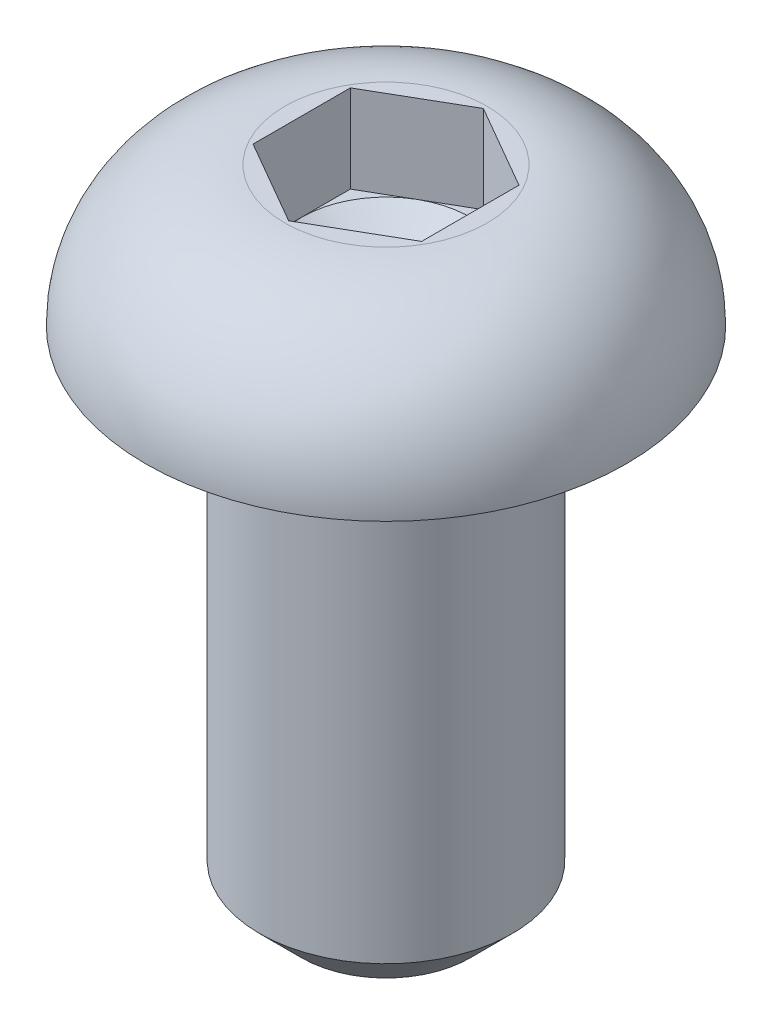
ISO-10303-21;
HEADER;
FILE_DESCRIPTION(('STEP AP214'),'2;1');
FILE_NAME('part.step','',(''),(''),'','','');
FILE_SCHEMA(('AUTOMOTIVE_DESIGN { 1 0 10303 214 1 1 1 1 }'));
ENDSEC;
DATA;
#1=APPLICATION_CONTEXT('core data for automotive mechanical design processes');
#2=APPLICATION_PROTOCOL_DEFINITION('international standard','automotive_design',2000,#1);
#3=PRODUCT_CONTEXT('',#1,'mechanical');
#4=PRODUCT('Part','Part','',(#3));
#5=PRODUCT_RELATED_PRODUCT_CATEGORY('part','',(#4));
#6=PRODUCT_DEFINITION_FORMATION('','',#4);
#7=PRODUCT_DEFINITION_CONTEXT('part definition',#1,'design');
#8=PRODUCT_DEFINITION('design','',#6,#7);
#9=PRODUCT_DEFINITION_SHAPE('','',#8);
#10=(LENGTH_UNIT() NAMED_UNIT(*) SI_UNIT(.MILLI.,.METRE.));
#11=(NAMED_UNIT(*) PLANE_ANGLE_UNIT() SI_UNIT($,.RADIAN.));
#12=(NAMED_UNIT(*) SI_UNIT($,.STERADIAN.) SOLID_ANGLE_UNIT());
#13=UNCERTAINTY_MEASURE_WITH_UNIT(LENGTH_MEASURE(1.E-05),#10,'distance_accuracy_value','');
#14=(GEOMETRIC_REPRESENTATION_CONTEXT(3) GLOBAL_UNCERTAINTY_ASSIGNED_CONTEXT((#13)) GLOBAL_UNIT_ASSIGNED_CONTEXT((#10,
#11,#12)) REPRESENTATION_CONTEXT('',''));
#15=CARTESIAN_POINT('',(0.,0.,0.));
#16=DIRECTION('',(0.,0.,1.));
#17=DIRECTION('',(1.,0.,0.));
#18=AXIS2_PLACEMENT_3D('',#15,#16,#17);
#19=CARTESIAN_POINT('',(0.,0.60999999999467,0.));
#20=DIRECTION('',(0.,1.,0.));
#21=DIRECTION('',(0.,0.,1.));
#22=AXIS2_PLACEMENT_3D('',#19,#20,#21);
#23=CONICAL_SURFACE('',#22,0.99999999991951,1.04719755099412);
#24=CARTESIAN_POINT('',(-1.13686837721616E-10,0.0326497307696627,0.));
#25=VERTEX_POINT('',#24);
#26=VERTEX_LOOP('',#25);
#27=FACE_BOUND('',#26,.T.);
#28=CARTESIAN_POINT('',(0.,0.610000000060308,0.));
#29=DIRECTION('',(0.,1.,0.));
#30=DIRECTION('',(0.,0.,1.));
#31=AXIS2_PLACEMENT_3D('',#28,#29,#30);
#32=CIRCLE('',#31,1.0000000000332);
#33=CARTESIAN_POINT('',(-0.500000000008299,0.610000000030154,-0.866025403798813));
#34=VERTEX_POINT('',#33);
#35=CARTESIAN_POINT('',(0.500000000008297,0.610000000030154,-0.866025403798814));
#36=VERTEX_POINT('',#35);
#37=EDGE_CURVE('E20',#34,#36,#32,.F.);
#38=ORIENTED_EDGE('',*,*,#37,.F.);
#39=CARTESIAN_POINT('',(0.,0.610000000060308,0.));
#40=DIRECTION('',(0.,1.,0.));
#41=DIRECTION('',(0.,0.,1.));
#42=AXIS2_PLACEMENT_3D('',#39,#40,#41);
#43=CIRCLE('',#42,1.0000000000332);
#44=CARTESIAN_POINT('',(-1.0000000000166,0.610000000030154,0.));
#45=VERTEX_POINT('',#44);
#46=EDGE_CURVE('E151',#45,#34,#43,.F.);
#47=ORIENTED_EDGE('',*,*,#46,.F.);
#48=CARTESIAN_POINT('',(0.,0.610000000060308,0.));
#49=DIRECTION('',(0.,1.,0.));
#50=DIRECTION('',(0.,0.,1.));
#51=AXIS2_PLACEMENT_3D('',#48,#49,#50);
#52=CIRCLE('',#51,1.0000000000332);
#53=CARTESIAN_POINT('',(-0.5000000000083,0.610000000030154,0.866025403798813));
#54=VERTEX_POINT('',#53);
#55=EDGE_CURVE('E127',#54,#45,#52,.F.);
#56=ORIENTED_EDGE('',*,*,#55,.F.);
#57=CARTESIAN_POINT('',(0.,0.610000000060308,0.));
#58=DIRECTION('',(0.,1.,0.));
#59=DIRECTION('',(0.,0.,1.));
#60=AXIS2_PLACEMENT_3D('',#57,#58,#59);
#61=CIRCLE('',#60,1.0000000000332);
#62=CARTESIAN_POINT('',(0.5000000000083,0.610000000030154,0.866025403798812));
#63=VERTEX_POINT('',#62);
#64=EDGE_CURVE('E153',#63,#54,#61,.F.);
#65=ORIENTED_EDGE('',*,*,#64,.F.);
#66=CARTESIAN_POINT('',(0.,0.610000000060308,0.));
#67=DIRECTION('',(0.,1.,0.));
#68=DIRECTION('',(0.,0.,1.));
#69=AXIS2_PLACEMENT_3D('',#66,#67,#68);
#70=CIRCLE('',#69,1.0000000000332);
#71=CARTESIAN_POINT('',(1.0000000000166,0.610000000030154,0.));
#72=VERTEX_POINT('',#71);
#73=EDGE_CURVE('E94',#72,#63,#70,.F.);
#74=ORIENTED_EDGE('',*,*,#73,.F.);
#75=CARTESIAN_POINT('',(0.,0.610000000060308,0.));
#76=DIRECTION('',(0.,1.,0.));
#77=DIRECTION('',(0.,0.,1.));
#78=AXIS2_PLACEMENT_3D('',#75,#76,#77);
#79=CIRCLE('',#78,1.0000000000332);
#80=EDGE_CURVE('E91',#36,#72,#79,.F.);
#81=ORIENTED_EDGE('',*,*,#80,.F.);
#82=EDGE_LOOP('',(#38,#47,#56,#65,#74,#81));
#83=FACE_BOUND('',#82,.T.);
#84=ADVANCED_FACE('F17',(#27,#83),#23,.F.);
#85=CARTESIAN_POINT('',(0.,0.61,0.));
#86=DIRECTION('',(0.,1.,0.));
#87=DIRECTION('',(0.,0.,1.));
#88=AXIS2_PLACEMENT_3D('',#85,#86,#87);
#89=PLANE('',#88);
#90=DIRECTION('',(-0.86602540378444,0.,-0.499999999999998));
#91=VECTOR('',#90,1.);
#92=CARTESIAN_POINT('',(1.,0.61,-0.577350269189627));
#93=LINE('',#92,#91);
#94=CARTESIAN_POINT('',(0.,0.61,-1.15470053837925));
#95=VERTEX_POINT('',#94);
#96=EDGE_CURVE('E105',#36,#95,#93,.T.);
#97=ORIENTED_EDGE('',*,*,#96,.T.);
#98=DIRECTION('',(-0.866025403784439,0.,0.5));
#99=VECTOR('',#98,1.);
#100=CARTESIAN_POINT('',(0.,0.61,-1.15470053837925));
#101=LINE('',#100,#99);
#102=EDGE_CURVE('E111',#95,#34,#101,.T.);
#103=ORIENTED_EDGE('',*,*,#102,.T.);
#104=ORIENTED_EDGE('',*,*,#37,.T.);
#105=EDGE_LOOP('',(#97,#103,#104));
#106=FACE_BOUND('',#105,.T.);
#107=ADVANCED_FACE('F109',(#106),#89,.T.);
#108=CARTESIAN_POINT('',(0.,0.61,0.));
#109=DIRECTION('',(0.,1.,0.));
#110=DIRECTION('',(0.,0.,1.));
#111=AXIS2_PLACEMENT_3D('',#108,#109,#110);
#112=PLANE('',#111);
#113=DIRECTION('',(0.,0.,-1.));
#114=VECTOR('',#113,1.);
#115=CARTESIAN_POINT('',(1.,0.61,0.577350269189625));
#116=LINE('',#115,#114);
#117=CARTESIAN_POINT('',(1.,0.61,-0.577350269189627));
#118=VERTEX_POINT('',#117);
#119=EDGE_CURVE('E101',#72,#118,#116,.T.);
#120=ORIENTED_EDGE('',*,*,#119,.T.);
#121=DIRECTION('',(-0.86602540378444,0.,-0.499999999999998));
#122=VECTOR('',#121,1.);
#123=CARTESIAN_POINT('',(1.,0.61,-0.577350269189627));
#124=LINE('',#123,#122);
#125=EDGE_CURVE('E99',#118,#36,#124,.T.);
#126=ORIENTED_EDGE('',*,*,#125,.T.);
#127=ORIENTED_EDGE('',*,*,#80,.T.);
#128=EDGE_LOOP('',(#120,#126,#127));
#129=FACE_BOUND('',#128,.T.);
#130=ADVANCED_FACE('F100',(#129),#112,.T.);
#131=CARTESIAN_POINT('',(0.,0.61,0.));
#132=DIRECTION('',(0.,1.,0.));
#133=DIRECTION('',(0.,0.,1.));
#134=AXIS2_PLACEMENT_3D('',#131,#132,#133);
#135=PLANE('',#134);
#136=DIRECTION('',(0.866025403784438,0.,-0.500000000000001));
#137=VECTOR('',#136,1.);
#138=CARTESIAN_POINT('',(0.,0.61,1.15470053837925));
#139=LINE('',#138,#137);
#140=CARTESIAN_POINT('',(0.999999999999999,0.61,0.577350269189624));
#141=VERTEX_POINT('',#140);
#142=EDGE_CURVE('E159',#63,#141,#139,.T.);
#143=ORIENTED_EDGE('',*,*,#142,.T.);
#144=DIRECTION('',(0.,0.,-1.));
#145=VECTOR('',#144,1.);
#146=CARTESIAN_POINT('',(1.,0.61,0.577350269189625));
#147=LINE('',#146,#145);
#148=EDGE_CURVE('E118',#141,#72,#147,.T.);
#149=ORIENTED_EDGE('',*,*,#148,.T.);
#150=ORIENTED_EDGE('',*,*,#73,.T.);
#151=EDGE_LOOP('',(#143,#149,#150));
#152=FACE_BOUND('',#151,.T.);
#153=ADVANCED_FACE('F158',(#152),#135,.T.);
#154=CARTESIAN_POINT('',(0.,0.61,0.));
#155=DIRECTION('',(0.,1.,0.));
#156=DIRECTION('',(0.,0.,1.));
#157=AXIS2_PLACEMENT_3D('',#154,#155,#156);
#158=PLANE('',#157);
#159=DIRECTION('',(0.866025403784438,0.,0.500000000000001));
#160=VECTOR('',#159,1.);
#161=CARTESIAN_POINT('',(-1.,0.61,0.577350269189625));
#162=LINE('',#161,#160);
#163=CARTESIAN_POINT('',(0.,0.61,1.15470053837925));
#164=VERTEX_POINT('',#163);
#165=EDGE_CURVE('E223',#54,#164,#162,.T.);
#166=ORIENTED_EDGE('',*,*,#165,.T.);
#167=DIRECTION('',(0.866025403784438,0.,-0.500000000000001));
#168=VECTOR('',#167,1.);
#169=CARTESIAN_POINT('',(0.,0.61,1.15470053837925));
#170=LINE('',#169,#168);
#171=EDGE_CURVE('E166',#164,#63,#170,.T.);
#172=ORIENTED_EDGE('',*,*,#171,.T.);
#173=ORIENTED_EDGE('',*,*,#64,.T.);
#174=EDGE_LOOP('',(#166,#172,#173));
#175=FACE_BOUND('',#174,.T.);
#176=ADVANCED_FACE('F320',(#175),#158,.T.);
#177=CARTESIAN_POINT('',(0.,0.61,0.));
#178=DIRECTION('',(0.,1.,0.));
#179=DIRECTION('',(0.,0.,1.));
#180=AXIS2_PLACEMENT_3D('',#177,#178,#179);
#181=PLANE('',#180);
#182=DIRECTION('',(-0.866025403784439,0.,0.5));
#183=VECTOR('',#182,1.);
#184=CARTESIAN_POINT('',(0.,0.61,-1.15470053837925));
#185=LINE('',#184,#183);
#186=CARTESIAN_POINT('',(-1.,0.61,-0.577350269189627));
#187=VERTEX_POINT('',#186);
#188=EDGE_CURVE('E106',#34,#187,#185,.T.);
#189=ORIENTED_EDGE('',*,*,#188,.T.);
#190=DIRECTION('',(0.,0.,1.));
#191=VECTOR('',#190,1.);
#192=CARTESIAN_POINT('',(-1.,0.61,-0.577350269189627));
#193=LINE('',#192,#191);
#194=EDGE_CURVE('E211',#187,#45,#193,.T.);
#195=ORIENTED_EDGE('',*,*,#194,.T.);
#196=ORIENTED_EDGE('',*,*,#46,.T.);
#197=EDGE_LOOP('',(#189,#195,#196));
#198=FACE_BOUND('',#197,.T.);
#199=ADVANCED_FACE('F316',(#198),#181,.T.);
#200=CARTESIAN_POINT('',(0.,0.61,0.));
#201=DIRECTION('',(0.,1.,0.));
#202=DIRECTION('',(0.,0.,1.));
#203=AXIS2_PLACEMENT_3D('',#200,#201,#202);
#204=PLANE('',#203);
#205=DIRECTION('',(0.,0.,1.));
#206=VECTOR('',#205,1.);
#207=CARTESIAN_POINT('',(-1.,0.61,-0.577350269189627));
#208=LINE('',#207,#206);
#209=CARTESIAN_POINT('',(-1.,0.61,0.577350269189625));
#210=VERTEX_POINT('',#209);
#211=EDGE_CURVE('E214',#45,#210,#208,.T.);
#212=ORIENTED_EDGE('',*,*,#211,.T.);
#213=DIRECTION('',(0.866025403784438,0.,0.500000000000001));
#214=VECTOR('',#213,1.);
#215=CARTESIAN_POINT('',(-1.,0.61,0.577350269189625));
#216=LINE('',#215,#214);
#217=EDGE_CURVE('E171',#210,#54,#216,.T.);
#218=ORIENTED_EDGE('',*,*,#217,.T.);
#219=ORIENTED_EDGE('',*,*,#55,.T.);
#220=EDGE_LOOP('',(#212,#218,#219));
#221=FACE_BOUND('',#220,.T.);
#222=ADVANCED_FACE('F312',(#221),#204,.T.);
#223=CARTESIAN_POINT('',(0.,0.61,-1.15470053837925));
#224=DIRECTION('',(-0.5,0.,-0.866025403784439));
#225=DIRECTION('',(-0.866025403784439,0.,0.5));
#226=AXIS2_PLACEMENT_3D('',#223,#224,#225);
#227=PLANE('',#226);
#228=DIRECTION('',(0.,1.,0.));
#229=VECTOR('',#228,1.);
#230=CARTESIAN_POINT('',(-1.,0.61,-0.577350269189627));
#231=LINE('',#230,#229);
#232=CARTESIAN_POINT('',(-1.,1.65,-0.577350269189627));
#233=VERTEX_POINT('',#232);
#234=EDGE_CURVE('E215',#233,#187,#231,.F.);
#235=ORIENTED_EDGE('',*,*,#234,.T.);
#236=ORIENTED_EDGE('',*,*,#188,.F.);
#237=ORIENTED_EDGE('',*,*,#102,.F.);
#238=DIRECTION('',(0.,1.,0.));
#239=VECTOR('',#238,1.);
#240=CARTESIAN_POINT('',(0.,0.61,-1.15470053837925));
#241=LINE('',#240,#239);
#242=CARTESIAN_POINT('',(0.,1.65,-1.15470053837925));
#243=VERTEX_POINT('',#242);
#244=EDGE_CURVE('E116',#95,#243,#241,.T.);
#245=ORIENTED_EDGE('',*,*,#244,.T.);
#246=DIRECTION('',(0.866025403784439,0.,-0.499999999999999));
#247=VECTOR('',#246,1.);
#248=CARTESIAN_POINT('',(-1.,1.65,-0.577350269189627));
#249=LINE('',#248,#247);
#250=EDGE_CURVE('E206',#233,#243,#249,.T.);
#251=ORIENTED_EDGE('',*,*,#250,.F.);
#252=EDGE_LOOP('',(#235,#236,#237,#245,#251));
#253=FACE_BOUND('',#252,.T.);
#254=ADVANCED_FACE('F309',(#253),#227,.F.);
#255=CARTESIAN_POINT('',(1.,0.61,-0.577350269189627));
#256=DIRECTION('',(0.499999999999998,0.,-0.86602540378444));
#257=DIRECTION('',(-0.86602540378444,0.,-0.499999999999998));
#258=AXIS2_PLACEMENT_3D('',#255,#256,#257);
#259=PLANE('',#258);
#260=ORIENTED_EDGE('',*,*,#244,.F.);
#261=ORIENTED_EDGE('',*,*,#96,.F.);
#262=ORIENTED_EDGE('',*,*,#125,.F.);
#263=DIRECTION('',(0.,1.,0.));
#264=VECTOR('',#263,1.);
#265=CARTESIAN_POINT('',(1.,0.61,-0.577350269189627));
#266=LINE('',#265,#264);
#267=CARTESIAN_POINT('',(1.,1.65,-0.577350269189627));
#268=VERTEX_POINT('',#267);
#269=EDGE_CURVE('E173',#118,#268,#266,.T.);
#270=ORIENTED_EDGE('',*,*,#269,.T.);
#271=DIRECTION('',(0.86602540378444,0.,0.499999999999997));
#272=VECTOR('',#271,1.);
#273=CARTESIAN_POINT('',(0.,1.65,-1.15470053837925));
#274=LINE('',#273,#272);
#275=EDGE_CURVE('E192',#243,#268,#274,.T.);
#276=ORIENTED_EDGE('',*,*,#275,.F.);
#277=EDGE_LOOP('',(#260,#261,#262,#270,#276));
#278=FACE_BOUND('',#277,.T.);
#279=ADVANCED_FACE('F114',(#278),#259,.F.);
#280=CARTESIAN_POINT('',(1.,0.61,0.577350269189625));
#281=DIRECTION('',(1.,0.,0.));
#282=DIRECTION('',(0.,0.,-1.));
#283=AXIS2_PLACEMENT_3D('',#280,#281,#282);
#284=PLANE('',#283);
#285=ORIENTED_EDGE('',*,*,#269,.F.);
#286=ORIENTED_EDGE('',*,*,#119,.F.);
#287=ORIENTED_EDGE('',*,*,#148,.F.);
#288=DIRECTION('',(0.,1.,0.));
#289=VECTOR('',#288,1.);
#290=CARTESIAN_POINT('',(0.999999999999999,0.61,0.577350269189623));
#291=LINE('',#290,#289);
#292=CARTESIAN_POINT('',(1.,1.65,0.577350269189625));
#293=VERTEX_POINT('',#292);
#294=EDGE_CURVE('E169',#141,#293,#291,.T.);
#295=ORIENTED_EDGE('',*,*,#294,.T.);
#296=DIRECTION('',(0.,0.,1.));
#297=VECTOR('',#296,1.);
#298=CARTESIAN_POINT('',(1.,1.65,0.));
#299=LINE('',#298,#297);
#300=EDGE_CURVE('E196',#268,#293,#299,.T.);
#301=ORIENTED_EDGE('',*,*,#300,.F.);
#302=EDGE_LOOP('',(#285,#286,#287,#295,#301));
#303=FACE_BOUND('',#302,.T.);
#304=ADVANCED_FACE('F197',(#303),#284,.F.);
#305=CARTESIAN_POINT('',(0.,0.61,1.15470053837925));
#306=DIRECTION('',(0.500000000000001,0.,0.866025403784438));
#307=DIRECTION('',(0.866025403784438,0.,-0.500000000000001));
#308=AXIS2_PLACEMENT_3D('',#305,#306,#307);
#309=PLANE('',#308);
#310=ORIENTED_EDGE('',*,*,#294,.F.);
#311=ORIENTED_EDGE('',*,*,#142,.F.);
#312=ORIENTED_EDGE('',*,*,#171,.F.);
#313=DIRECTION('',(0.,1.,0.));
#314=VECTOR('',#313,1.);
#315=CARTESIAN_POINT('',(0.,0.61,1.15470053837925));
#316=LINE('',#315,#314);
#317=CARTESIAN_POINT('',(0.,1.65,1.15470053837925));
#318=VERTEX_POINT('',#317);
#319=EDGE_CURVE('E231',#164,#318,#316,.T.);
#320=ORIENTED_EDGE('',*,*,#319,.T.);
#321=DIRECTION('',(-0.866025403784439,0.,0.499999999999999));
#322=VECTOR('',#321,1.);
#323=CARTESIAN_POINT('',(1.,1.65,0.577350269189625));
#324=LINE('',#323,#322);
#325=EDGE_CURVE('E200',#293,#318,#324,.T.);
#326=ORIENTED_EDGE('',*,*,#325,.F.);
#327=EDGE_LOOP('',(#310,#311,#312,#320,#326));
#328=FACE_BOUND('',#327,.T.);
#329=ADVANCED_FACE('F164',(#328),#309,.F.);
#330=CARTESIAN_POINT('',(-1.,0.61,0.577350269189625));
#331=DIRECTION('',(-0.500000000000001,0.,0.866025403784438));
#332=DIRECTION('',(0.866025403784438,0.,0.500000000000001));
#333=AXIS2_PLACEMENT_3D('',#330,#331,#332);
#334=PLANE('',#333);
#335=ORIENTED_EDGE('',*,*,#319,.F.);
#336=ORIENTED_EDGE('',*,*,#165,.F.);
#337=ORIENTED_EDGE('',*,*,#217,.F.);
#338=DIRECTION('',(0.,1.,0.));
#339=VECTOR('',#338,1.);
#340=CARTESIAN_POINT('',(-1.,0.61,0.577350269189625));
#341=LINE('',#340,#339);
#342=CARTESIAN_POINT('',(-1.,1.65,0.577350269189625));
#343=VERTEX_POINT('',#342);
#344=EDGE_CURVE('E35',#210,#343,#341,.T.);
#345=ORIENTED_EDGE('',*,*,#344,.T.);
#346=DIRECTION('',(-0.866025403784439,0.,-0.499999999999999));
#347=VECTOR('',#346,1.);
#348=CARTESIAN_POINT('',(0.,1.65,1.15470053837925));
#349=LINE('',#348,#347);
#350=EDGE_CURVE('E240',#318,#343,#349,.T.);
#351=ORIENTED_EDGE('',*,*,#350,.F.);
#352=EDGE_LOOP('',(#335,#336,#337,#345,#351));
#353=FACE_BOUND('',#352,.T.);
#354=ADVANCED_FACE('F248',(#353),#334,.F.);
#355=CARTESIAN_POINT('',(-1.,0.61,-0.577350269189627));
#356=DIRECTION('',(-1.,0.,0.));
#357=DIRECTION('',(0.,0.,1.));
#358=AXIS2_PLACEMENT_3D('',#355,#356,#357);
#359=PLANE('',#358);
#360=ORIENTED_EDGE('',*,*,#344,.F.);
#361=ORIENTED_EDGE('',*,*,#211,.F.);
#362=ORIENTED_EDGE('',*,*,#194,.F.);
#363=ORIENTED_EDGE('',*,*,#234,.F.);
#364=DIRECTION('',(0.,0.,1.));
#365=VECTOR('',#364,1.);
#366=CARTESIAN_POINT('',(-1.,1.65,0.));
#367=LINE('',#366,#365);
#368=EDGE_CURVE('E146',#343,#233,#367,.F.);
#369=ORIENTED_EDGE('',*,*,#368,.F.);
#370=EDGE_LOOP('',(#360,#361,#362,#363,#369));
#371=FACE_BOUND('',#370,.T.);
#372=ADVANCED_FACE('F297',(#371),#359,.F.);
#373=CARTESIAN_POINT('',(0.,1.65,0.));
#374=DIRECTION('',(0.,1.,0.));
#375=DIRECTION('',(0.,0.,1.));
#376=AXIS2_PLACEMENT_3D('',#373,#374,#375);
#377=PLANE('',#376);
#378=ORIENTED_EDGE('',*,*,#350,.T.);
#379=ORIENTED_EDGE('',*,*,#368,.T.);
#380=ORIENTED_EDGE('',*,*,#250,.T.);
#381=ORIENTED_EDGE('',*,*,#275,.T.);
#382=ORIENTED_EDGE('',*,*,#300,.T.);
#383=ORIENTED_EDGE('',*,*,#325,.T.);
#384=EDGE_LOOP('',(#378,#379,#380,#381,#382,#383));
#385=FACE_BOUND('',#384,.T.);
#386=CARTESIAN_POINT('',(0.,1.65000000000001,0.));
#387=DIRECTION('',(0.,-1.,0.));
#388=DIRECTION('',(0.,0.,-1.));
#389=AXIS2_PLACEMENT_3D('',#386,#387,#388);
#390=CIRCLE('',#389,1.19999999999978);
#391=CARTESIAN_POINT('',(0.,1.65000000000001,-1.19999999999978));
#392=VERTEX_POINT('',#391);
#393=EDGE_CURVE('E141',#392,#392,#390,.T.);
#394=ORIENTED_EDGE('',*,*,#393,.F.);
#395=EDGE_LOOP('',(#394));
#396=FACE_BOUND('',#395,.T.);
#397=ADVANCED_FACE('F203',(#385,#396),#377,.T.);
#398=CARTESIAN_POINT('',(0.,-2.1325005253703E-13,0.));
#399=DIRECTION('',(0.,-1.,0.));
#400=DIRECTION('',(0.,0.,1.));
#401=AXIS2_PLACEMENT_3D('',#398,#399,#400);
#402=DEGENERATE_TOROIDAL_SURFACE('',#401,1.19999999999978,1.65000000000022,.T.);
#403=CARTESIAN_POINT('',(0.,0.,0.));
#404=DIRECTION('',(0.,-1.,0.));
#405=DIRECTION('',(0.,0.,-1.));
#406=AXIS2_PLACEMENT_3D('',#403,#404,#405);
#407=CIRCLE('',#406,2.85);
#408=CARTESIAN_POINT('',(0.,0.,-2.85));
#409=VERTEX_POINT('',#408);
#410=EDGE_CURVE('E138',#409,#409,#407,.T.);
#411=ORIENTED_EDGE('',*,*,#410,.F.);
#412=EDGE_LOOP('',(#411));
#413=FACE_BOUND('',#412,.T.);
#414=ORIENTED_EDGE('',*,*,#393,.T.);
#415=EDGE_LOOP('',(#414));
#416=FACE_BOUND('',#415,.T.);
#417=ADVANCED_FACE('F291',(#413,#416),#402,.T.);
#418=CARTESIAN_POINT('',(0.,0.,0.));
#419=DIRECTION('',(0.,-1.,0.));
#420=DIRECTION('',(0.,0.,-1.));
#421=AXIS2_PLACEMENT_3D('',#418,#419,#420);
#422=PLANE('',#421);
#423=CARTESIAN_POINT('',(0.,0.,0.));
#424=DIRECTION('',(0.,-1.,0.));
#425=DIRECTION('',(0.,0.,1.));
#426=AXIS2_PLACEMENT_3D('',#423,#424,#425);
#427=CIRCLE('',#426,1.6);
#428=CARTESIAN_POINT('',(0.,0.,1.6));
#429=VERTEX_POINT('',#428);
#430=EDGE_CURVE('E135',#429,#429,#427,.F.);
#431=ORIENTED_EDGE('',*,*,#430,.T.);
#432=EDGE_LOOP('',(#431));
#433=FACE_BOUND('',#432,.T.);
#434=ORIENTED_EDGE('',*,*,#410,.T.);
#435=EDGE_LOOP('',(#434));
#436=FACE_BOUND('',#435,.T.);
#437=ADVANCED_FACE('F282',(#433,#436),#422,.T.);
#438=CARTESIAN_POINT('',(0.,-6.,0.));
#439=DIRECTION('',(0.,-1.,0.));
#440=DIRECTION('',(0.,0.,-1.));
#441=AXIS2_PLACEMENT_3D('',#438,#439,#440);
#442=PLANE('',#441);
#443=CARTESIAN_POINT('',(0.,-6.00000000002865,0.));
#444=DIRECTION('',(0.,1.,0.));
#445=DIRECTION('',(0.,0.,1.));
#446=AXIS2_PLACEMENT_3D('',#443,#444,#445);
#447=CIRCLE('',#446,1.0000000000332);
#448=CARTESIAN_POINT('',(0.,-6.00000000002865,1.0000000000332));
#449=VERTEX_POINT('',#448);
#450=EDGE_CURVE('E132',#449,#449,#447,.T.);
#451=ORIENTED_EDGE('',*,*,#450,.F.);
#452=EDGE_LOOP('',(#451));
#453=FACE_BOUND('',#452,.T.);
#454=ADVANCED_FACE('F269',(#453),#442,.T.);
#455=CARTESIAN_POINT('',(0.,-0.1,0.));
#456=DIRECTION('',(0.,-1.,0.));
#457=DIRECTION('',(0.,0.,1.));
#458=AXIS2_PLACEMENT_3D('',#455,#456,#457);
#459=TOROIDAL_SURFACE('',#458,1.6,0.1);
#460=CARTESIAN_POINT('',(0.,-0.1,0.));
#461=DIRECTION('',(0.,-1.,0.));
#462=DIRECTION('',(0.,0.,-1.));
#463=AXIS2_PLACEMENT_3D('',#460,#461,#462);
#464=CIRCLE('',#463,1.5);
#465=CARTESIAN_POINT('',(0.,-0.1,-1.5));
#466=VERTEX_POINT('',#465);
#467=EDGE_CURVE('E26',#466,#466,#464,.T.);
#468=ORIENTED_EDGE('',*,*,#467,.F.);
#469=EDGE_LOOP('',(#468));
#470=FACE_BOUND('',#469,.T.);
#471=ORIENTED_EDGE('',*,*,#430,.F.);
#472=EDGE_LOOP('',(#471));
#473=FACE_BOUND('',#472,.T.);
#474=ADVANCED_FACE('F257',(#470,#473),#459,.F.);
#475=CARTESIAN_POINT('',(0.,-5.50000000009732,0.));
#476=DIRECTION('',(0.,1.,0.));
#477=DIRECTION('',(0.,0.,1.));
#478=AXIS2_PLACEMENT_3D('',#475,#476,#477);
#479=CONICAL_SURFACE('',#478,1.49999999990769,0.785398163340605);
#480=ORIENTED_EDGE('',*,*,#450,.T.);
#481=EDGE_LOOP('',(#480));
#482=FACE_BOUND('',#481,.T.);
#483=CARTESIAN_POINT('',(0.,-5.5,0.));
#484=DIRECTION('',(0.,-1.,0.));
#485=DIRECTION('',(0.,0.,-1.));
#486=AXIS2_PLACEMENT_3D('',#483,#484,#485);
#487=CIRCLE('',#486,1.5);
#488=CARTESIAN_POINT('',(0.,-5.5,-1.5));
#489=VERTEX_POINT('',#488);
#490=EDGE_CURVE('E11',#489,#489,#487,.F.);
#491=ORIENTED_EDGE('',*,*,#490,.F.);
#492=EDGE_LOOP('',(#491));
#493=FACE_BOUND('',#492,.T.);
#494=ADVANCED_FACE('F268',(#482,#493),#479,.T.);
#495=CARTESIAN_POINT('',(0.,0.,0.));
#496=DIRECTION('',(0.,-1.,0.));
#497=DIRECTION('',(0.,0.,-1.));
#498=AXIS2_PLACEMENT_3D('',#495,#496,#497);
#499=CYLINDRICAL_SURFACE('',#498,1.5);
#500=ORIENTED_EDGE('',*,*,#490,.T.);
#501=EDGE_LOOP('',(#500));
#502=FACE_BOUND('',#501,.T.);
#503=ORIENTED_EDGE('',*,*,#467,.T.);
#504=EDGE_LOOP('',(#503));
#505=FACE_BOUND('',#504,.T.);
#506=ADVANCED_FACE('F334',(#502,#505),#499,.T.);
#507=CLOSED_SHELL('',(#84,#107,#130,#153,#176,#199,#222,#254,#279,#304,#329,#354,#372,#397,#417,
#437,#454,#474,#494,#506));
#508=MANIFOLD_SOLID_BREP('B1',#507);
#509=ADVANCED_BREP_SHAPE_REPRESENTATION('',(#18,#508),#14);
#510=SHAPE_DEFINITION_REPRESENTATION(#9,#509);
ENDSEC;
END-ISO-10303-21;
